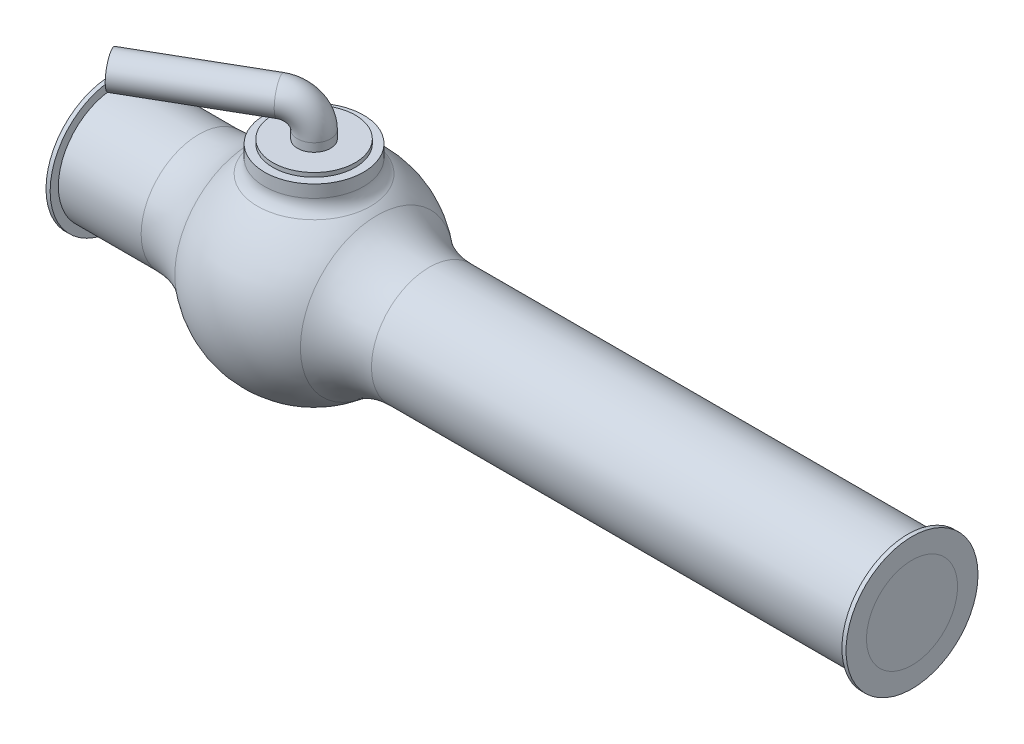
ISO-10303-21;
HEADER;
FILE_DESCRIPTION(('STEP AP214'),'2;1');
FILE_NAME('part.step','',(''),(''),'','','');
FILE_SCHEMA(('AUTOMOTIVE_DESIGN { 1 0 10303 214 1 1 1 1 }'));
ENDSEC;
DATA;
#1=APPLICATION_CONTEXT('core data for automotive mechanical design processes');
#2=APPLICATION_PROTOCOL_DEFINITION('international standard','automotive_design',2000,#1);
#3=PRODUCT_CONTEXT('',#1,'mechanical');
#4=PRODUCT('Part','Part','',(#3));
#5=PRODUCT_RELATED_PRODUCT_CATEGORY('part','',(#4));
#6=PRODUCT_DEFINITION_FORMATION('','',#4);
#7=PRODUCT_DEFINITION_CONTEXT('part definition',#1,'design');
#8=PRODUCT_DEFINITION('design','',#6,#7);
#9=PRODUCT_DEFINITION_SHAPE('','',#8);
#10=(LENGTH_UNIT() NAMED_UNIT(*) SI_UNIT(.MILLI.,.METRE.));
#11=(NAMED_UNIT(*) PLANE_ANGLE_UNIT() SI_UNIT($,.RADIAN.));
#12=(NAMED_UNIT(*) SI_UNIT($,.STERADIAN.) SOLID_ANGLE_UNIT());
#13=UNCERTAINTY_MEASURE_WITH_UNIT(LENGTH_MEASURE(1.E-05),#10,'distance_accuracy_value','');
#14=(GEOMETRIC_REPRESENTATION_CONTEXT(3) GLOBAL_UNCERTAINTY_ASSIGNED_CONTEXT((#13)) GLOBAL_UNIT_ASSIGNED_CONTEXT((#10,
#11,#12)) REPRESENTATION_CONTEXT('',''));
#15=CARTESIAN_POINT('',(0.,0.,0.));
#16=DIRECTION('',(0.,0.,1.));
#17=DIRECTION('',(1.,0.,0.));
#18=AXIS2_PLACEMENT_3D('',#15,#16,#17);
#19=CARTESIAN_POINT('',(0.,0.,0.));
#20=DIRECTION('',(0.,1.,0.));
#21=DIRECTION('',(0.,0.,-1.));
#22=AXIS2_PLACEMENT_3D('',#19,#20,#21);
#23=SPHERICAL_SURFACE('',#22,120.);
#24=CARTESIAN_POINT('',(0.,98.4782167977948,0.));
#25=DIRECTION('',(0.,-1.,0.));
#26=DIRECTION('',(0.,0.,-1.));
#27=AXIS2_PLACEMENT_3D('',#24,#25,#26);
#28=CIRCLE('',#27,68.5714285714286);
#29=CARTESIAN_POINT('',(0.,98.4782167977948,-68.5714285714286));
#30=VERTEX_POINT('',#29);
#31=EDGE_CURVE('P0_E11',#30,#30,#28,.T.);
#32=ORIENTED_EDGE('',*,*,#31,.T.);
#33=EDGE_LOOP('',(#32));
#34=FACE_BOUND('',#33,.T.);
#35=CARTESIAN_POINT('',(76.1685820569215,0.,0.));
#36=DIRECTION('',(-1.,0.,0.));
#37=DIRECTION('',(0.,0.,1.));
#38=AXIS2_PLACEMENT_3D('',#35,#36,#37);
#39=CIRCLE('',#38,92.7272727272727);
#40=CARTESIAN_POINT('',(76.1685820569215,0.,92.7272727272727));
#41=VERTEX_POINT('',#40);
#42=EDGE_CURVE('P0_E89',#41,#41,#39,.T.);
#43=ORIENTED_EDGE('',*,*,#42,.T.);
#44=EDGE_LOOP('',(#43));
#45=FACE_BOUND('',#44,.T.);
#46=CARTESIAN_POINT('',(-76.1685820569215,0.,0.));
#47=DIRECTION('',(1.,0.,0.));
#48=DIRECTION('',(0.,0.,-1.));
#49=AXIS2_PLACEMENT_3D('',#46,#47,#48);
#50=CIRCLE('',#49,92.7272727272727);
#51=CARTESIAN_POINT('',(-76.1685820569215,0.,-92.7272727272727));
#52=VERTEX_POINT('',#51);
#53=EDGE_CURVE('P0_E82',#52,#52,#50,.T.);
#54=ORIENTED_EDGE('',*,*,#53,.T.);
#55=EDGE_LOOP('',(#54));
#56=FACE_BOUND('',#55,.T.);
#57=ADVANCED_FACE('P0_F33',(#34,#45,#56),#23,.T.);
#58=CARTESIAN_POINT('',(0.,0.,0.));
#59=DIRECTION('',(0.,1.,0.));
#60=DIRECTION('',(0.,0.,-1.));
#61=AXIS2_PLACEMENT_3D('',#58,#59,#60);
#62=SPHERICAL_SURFACE('',#61,100.);
#63=CARTESIAN_POINT('',(-83.3885822273715,0.,0.));
#64=DIRECTION('',(1.,0.,0.));
#65=DIRECTION('',(0.,0.,-1.));
#66=AXIS2_PLACEMENT_3D('',#63,#64,#65);
#67=CIRCLE('',#66,55.1936985);
#68=CARTESIAN_POINT('',(-83.3885822273715,-50.4687461797641,22.3439032658002));
#69=VERTEX_POINT('',#68);
#70=CARTESIAN_POINT('',(-83.3885822273715,50.4687461797642,22.3439032658002));
#71=VERTEX_POINT('',#70);
#72=EDGE_CURVE('P0_E47',#69,#71,#67,.F.);
#73=ORIENTED_EDGE('',*,*,#72,.T.);
#74=CARTESIAN_POINT('',(-72.2166305944713,0.,41.6942911136856));
#75=DIRECTION('',(0.86602540378444,0.,-0.499999999999998));
#76=DIRECTION('',(-0.499999999999998,0.,-0.86602540378444));
#77=AXIS2_PLACEMENT_3D('',#74,#75,#76);
#78=CIRCLE('',#77,55.1936985);
#79=EDGE_CURVE('P0_E69',#71,#69,#78,.T.);
#80=ORIENTED_EDGE('',*,*,#79,.T.);
#81=EDGE_LOOP('',(#73,#80));
#82=FACE_BOUND('',#81,.T.);
#83=ADVANCED_FACE('P0_F77',(#82),#62,.F.);
#84=CARTESIAN_POINT('',(0.,135.,0.));
#85=DIRECTION('',(0.,1.,0.));
#86=DIRECTION('',(0.,0.,1.));
#87=AXIS2_PLACEMENT_3D('',#84,#85,#86);
#88=PLANE('',#87);
#89=CARTESIAN_POINT('',(0.,135.,0.));
#90=DIRECTION('',(0.,1.,0.));
#91=DIRECTION('',(0.,0.,1.));
#92=AXIS2_PLACEMENT_3D('',#89,#90,#91);
#93=CIRCLE('',#92,50.);
#94=CARTESIAN_POINT('',(0.,135.,50.));
#95=VERTEX_POINT('',#94);
#96=EDGE_CURVE('P0_E196',#95,#95,#93,.T.);
#97=ORIENTED_EDGE('',*,*,#96,.T.);
#98=EDGE_LOOP('',(#97));
#99=FACE_BOUND('',#98,.T.);
#100=CARTESIAN_POINT('',(0.,135.,0.));
#101=DIRECTION('',(0.,1.,0.));
#102=DIRECTION('',(0.,0.,1.));
#103=AXIS2_PLACEMENT_3D('',#100,#101,#102);
#104=CIRCLE('',#103,20.);
#105=CARTESIAN_POINT('',(0.,135.,20.));
#106=VERTEX_POINT('',#105);
#107=EDGE_CURVE('P0_E185',#106,#106,#104,.T.);
#108=ORIENTED_EDGE('',*,*,#107,.F.);
#109=EDGE_LOOP('',(#108));
#110=FACE_BOUND('',#109,.T.);
#111=ADVANCED_FACE('P0_F115',(#99,#110),#88,.T.);
#112=CARTESIAN_POINT('',(0.,135.,0.));
#113=DIRECTION('',(0.,-1.,0.));
#114=DIRECTION('',(0.,0.,-1.));
#115=AXIS2_PLACEMENT_3D('',#112,#113,#114);
#116=CYLINDRICAL_SURFACE('',#115,50.);
#117=ORIENTED_EDGE('',*,*,#96,.F.);
#118=EDGE_LOOP('',(#117));
#119=FACE_BOUND('',#118,.T.);
#120=CARTESIAN_POINT('',(0.,130.,0.));
#121=DIRECTION('',(0.,1.,0.));
#122=DIRECTION('',(0.,0.,1.));
#123=AXIS2_PLACEMENT_3D('',#120,#121,#122);
#124=CIRCLE('',#123,50.);
#125=CARTESIAN_POINT('',(0.,130.,50.));
#126=VERTEX_POINT('',#125);
#127=EDGE_CURVE('P0_E182',#126,#126,#124,.T.);
#128=ORIENTED_EDGE('',*,*,#127,.T.);
#129=EDGE_LOOP('',(#128));
#130=FACE_BOUND('',#129,.T.);
#131=ADVANCED_FACE('P0_F143',(#119,#130),#116,.T.);
#132=CARTESIAN_POINT('',(-25.9807621135333,175.,14.9999999999999));
#133=DIRECTION('',(-0.866025403784442,0.,0.499999999999995));
#134=DIRECTION('',(0.499999999999995,0.,0.866025403784442));
#135=AXIS2_PLACEMENT_3D('',#132,#133,#134);
#136=CYLINDRICAL_SURFACE('',#135,20.);
#137=CARTESIAN_POINT('',(-25.9807621135333,175.,14.9999999999999));
#138=DIRECTION('',(-0.866025403784442,0.,0.499999999999995));
#139=DIRECTION('',(0.433012701892216,-0.499999999999995,0.750000000000005));
#140=AXIS2_PLACEMENT_3D('',#137,#138,#139);
#141=CIRCLE('',#140,20.);
#142=CARTESIAN_POINT('',(-25.9807621135333,195.,14.9999999999999));
#143=VERTEX_POINT('',#142);
#144=EDGE_CURVE('P0_E189',#143,#143,#141,.T.);
#145=ORIENTED_EDGE('',*,*,#144,.T.);
#146=EDGE_LOOP('',(#145));
#147=FACE_BOUND('',#146,.T.);
#148=CARTESIAN_POINT('',(-155.8845726812,175.,89.9999999999991));
#149=DIRECTION('',(-0.866025403784442,0.,0.499999999999995));
#150=DIRECTION('',(0.433012701892216,-0.499999999999995,0.750000000000005));
#151=AXIS2_PLACEMENT_3D('',#148,#149,#150);
#152=CIRCLE('',#151,20.);
#153=CARTESIAN_POINT('',(-147.224318643355,165.,104.999999999999));
#154=VERTEX_POINT('',#153);
#155=EDGE_CURVE('P0_E194',#154,#154,#152,.T.);
#156=ORIENTED_EDGE('',*,*,#155,.F.);
#157=EDGE_LOOP('',(#156));
#158=FACE_BOUND('',#157,.T.);
#159=ADVANCED_FACE('P0_F139',(#147,#158),#136,.T.);
#160=CARTESIAN_POINT('',(-25.9807621135332,145.,14.9999999999998));
#161=DIRECTION('',(0.499999999999995,0.,0.866025403784442));
#162=DIRECTION('',(0.866025403784442,0.,-0.499999999999995));
#163=AXIS2_PLACEMENT_3D('',#160,#161,#162);
#164=TOROIDAL_SURFACE('',#163,30.,20.);
#165=CARTESIAN_POINT('',(0.,145.,0.));
#166=DIRECTION('',(0.,1.,0.));
#167=DIRECTION('',(0.,0.,1.));
#168=AXIS2_PLACEMENT_3D('',#165,#166,#167);
#169=CIRCLE('',#168,20.);
#170=CARTESIAN_POINT('',(17.3205080756888,145.,-9.9999999999999));
#171=VERTEX_POINT('',#170);
#172=EDGE_CURVE('P0_E186',#171,#171,#169,.T.);
#173=CARTESIAN_POINT('',(-25.9807621135332,145.,14.9999999999998));
#174=DIRECTION('',(0.499999999999995,0.,0.866025403784442));
#175=DIRECTION('',(0.866025403784442,0.,-0.499999999999995));
#176=AXIS2_PLACEMENT_3D('',#173,#174,#175);
#177=CIRCLE('',#176,50.);
#178=EDGE_CURVE('',#171,#143,#177,.T.);
#179=ORIENTED_EDGE('',*,*,#172,.T.);
#180=ORIENTED_EDGE('',*,*,#144,.F.);
#181=ORIENTED_EDGE('',*,*,#178,.T.);
#182=ORIENTED_EDGE('',*,*,#178,.F.);
#183=EDGE_LOOP('',(#179,#181,#180,#182));
#184=FACE_BOUND('',#183,.T.);
#185=ADVANCED_FACE('P0_F135',(#184),#164,.T.);
#186=CARTESIAN_POINT('',(0.,145.,0.));
#187=DIRECTION('',(0.,-1.,0.));
#188=DIRECTION('',(0.,0.,-1.));
#189=AXIS2_PLACEMENT_3D('',#186,#187,#188);
#190=CYLINDRICAL_SURFACE('',#189,20.);
#191=ORIENTED_EDGE('',*,*,#172,.F.);
#192=EDGE_LOOP('',(#191));
#193=FACE_BOUND('',#192,.T.);
#194=ORIENTED_EDGE('',*,*,#107,.T.);
#195=EDGE_LOOP('',(#194));
#196=FACE_BOUND('',#195,.T.);
#197=ADVANCED_FACE('P0_F131',(#193,#196),#190,.T.);
#198=CARTESIAN_POINT('',(-155.8845726812,175.,89.9999999999991));
#199=DIRECTION('',(-0.866025403784442,0.,0.499999999999995));
#200=DIRECTION('',(0.433012701892216,-0.499999999999995,0.750000000000005));
#201=AXIS2_PLACEMENT_3D('',#198,#199,#200);
#202=PLANE('',#201);
#203=ORIENTED_EDGE('',*,*,#155,.T.);
#204=EDGE_LOOP('',(#203));
#205=FACE_BOUND('',#204,.T.);
#206=ADVANCED_FACE('P0_F124',(#205),#202,.T.);
#207=CARTESIAN_POINT('',(0.,180.,0.));
#208=DIRECTION('',(0.,1.,0.));
#209=DIRECTION('',(0.,0.,1.));
#210=AXIS2_PLACEMENT_3D('',#207,#208,#209);
#211=CYLINDRICAL_SURFACE('',#210,60.);
#212=CARTESIAN_POINT('',(0.,114.891252930761,0.));
#213=DIRECTION('',(0.,-1.,0.));
#214=DIRECTION('',(0.,0.,-1.));
#215=AXIS2_PLACEMENT_3D('',#212,#213,#214);
#216=CIRCLE('',#215,60.);
#217=CARTESIAN_POINT('',(0.,114.891252930761,-60.));
#218=VERTEX_POINT('',#217);
#219=EDGE_CURVE('P0_E41',#218,#218,#216,.F.);
#220=ORIENTED_EDGE('',*,*,#219,.T.);
#221=EDGE_LOOP('',(#220));
#222=FACE_BOUND('',#221,.T.);
#223=CARTESIAN_POINT('',(0.,130.,0.));
#224=DIRECTION('',(0.,1.,0.));
#225=DIRECTION('',(0.,0.,1.));
#226=AXIS2_PLACEMENT_3D('',#223,#224,#225);
#227=CIRCLE('',#226,60.);
#228=CARTESIAN_POINT('',(0.,130.,60.));
#229=VERTEX_POINT('',#228);
#230=EDGE_CURVE('P0_E179',#229,#229,#227,.T.);
#231=ORIENTED_EDGE('',*,*,#230,.F.);
#232=EDGE_LOOP('',(#231));
#233=FACE_BOUND('',#232,.T.);
#234=ADVANCED_FACE('P0_F97',(#222,#233),#211,.T.);
#235=CARTESIAN_POINT('',(0.,130.,-40.));
#236=DIRECTION('',(0.,1.,0.));
#237=DIRECTION('',(0.,0.,1.));
#238=AXIS2_PLACEMENT_3D('',#235,#236,#237);
#239=PLANE('',#238);
#240=ORIENTED_EDGE('',*,*,#230,.T.);
#241=EDGE_LOOP('',(#240));
#242=FACE_BOUND('',#241,.T.);
#243=ORIENTED_EDGE('',*,*,#127,.F.);
#244=EDGE_LOOP('',(#243));
#245=FACE_BOUND('',#244,.T.);
#246=ADVANCED_FACE('P0_F123',(#242,#245),#239,.T.);
#247=CARTESIAN_POINT('',(-165.885572681199,0.,0.));
#248=DIRECTION('',(1.,0.,0.));
#249=DIRECTION('',(0.,0.,-1.));
#250=AXIS2_PLACEMENT_3D('',#247,#248,#249);
#251=CYLINDRICAL_SURFACE('',#250,70.);
#252=CARTESIAN_POINT('',(139.642400437689,0.,0.));
#253=DIRECTION('',(-1.,0.,0.));
#254=DIRECTION('',(0.,0.,1.));
#255=AXIS2_PLACEMENT_3D('',#252,#253,#254);
#256=CIRCLE('',#255,70.);
#257=CARTESIAN_POINT('',(139.642400437689,0.,70.));
#258=VERTEX_POINT('',#257);
#259=EDGE_CURVE('P0_E80',#258,#258,#256,.F.);
#260=ORIENTED_EDGE('',*,*,#259,.T.);
#261=EDGE_LOOP('',(#260));
#262=FACE_BOUND('',#261,.T.);
#263=CARTESIAN_POINT('',(720.,0.,0.));
#264=DIRECTION('',(1.,0.,0.));
#265=DIRECTION('',(0.,0.,-1.));
#266=AXIS2_PLACEMENT_3D('',#263,#264,#265);
#267=CIRCLE('',#266,70.);
#268=CARTESIAN_POINT('',(720.,0.,-70.));
#269=VERTEX_POINT('',#268);
#270=EDGE_CURVE('P0_E78',#269,#269,#267,.T.);
#271=ORIENTED_EDGE('',*,*,#270,.F.);
#272=EDGE_LOOP('',(#271));
#273=FACE_BOUND('',#272,.T.);
#274=ADVANCED_FACE('P0_F127',(#262,#273),#251,.T.);
#275=CARTESIAN_POINT('',(118.301270189222,0.,-68.3012701892216));
#276=DIRECTION('',(-0.86602540378444,0.,0.499999999999998));
#277=DIRECTION('',(0.499999999999998,0.,0.86602540378444));
#278=AXIS2_PLACEMENT_3D('',#275,#276,#277);
#279=CYLINDRICAL_SURFACE('',#278,55.1936985);
#280=CARTESIAN_POINT('',(72.2166305944714,0.,-41.6942911136856));
#281=DIRECTION('',(-0.86602540378444,0.,0.499999999999998));
#282=DIRECTION('',(0.499999999999998,0.,0.86602540378444));
#283=AXIS2_PLACEMENT_3D('',#280,#281,#282);
#284=CIRCLE('',#283,55.1936985);
#285=CARTESIAN_POINT('',(83.3885822273715,50.4687461797642,-22.3439032658004));
#286=VERTEX_POINT('',#285);
#287=CARTESIAN_POINT('',(83.3885822273715,-50.4687461797642,-22.3439032658004));
#288=VERTEX_POINT('',#287);
#289=EDGE_CURVE('P0_E70',#286,#288,#284,.T.);
#290=ORIENTED_EDGE('',*,*,#289,.F.);
#291=EDGE_CURVE('P0_E198',#288,#286,#284,.T.);
#292=ORIENTED_EDGE('',*,*,#291,.F.);
#293=EDGE_LOOP('',(#290,#292));
#294=FACE_BOUND('',#293,.T.);
#295=ORIENTED_EDGE('',*,*,#79,.F.);
#296=EDGE_CURVE('P0_E63',#69,#71,#78,.T.);
#297=ORIENTED_EDGE('',*,*,#296,.F.);
#298=EDGE_LOOP('',(#295,#297));
#299=FACE_BOUND('',#298,.T.);
#300=ADVANCED_FACE('P0_F79',(#294,#299),#279,.F.);
#301=CARTESIAN_POINT('',(0.,0.,0.));
#302=DIRECTION('',(0.,1.,0.));
#303=DIRECTION('',(0.,0.,-1.));
#304=AXIS2_PLACEMENT_3D('',#301,#302,#303);
#305=SPHERICAL_SURFACE('',#304,100.);
#306=ORIENTED_EDGE('',*,*,#291,.T.);
#307=CARTESIAN_POINT('',(83.3885822273715,0.,0.));
#308=DIRECTION('',(-1.,0.,0.));
#309=DIRECTION('',(0.,0.,1.));
#310=AXIS2_PLACEMENT_3D('',#307,#308,#309);
#311=CIRCLE('',#310,55.1936985);
#312=EDGE_CURVE('P0_E174',#288,#286,#311,.T.);
#313=ORIENTED_EDGE('',*,*,#312,.F.);
#314=EDGE_LOOP('',(#306,#313));
#315=FACE_BOUND('',#314,.T.);
#316=ADVANCED_FACE('P0_F153',(#315),#305,.T.);
#317=ORIENTED_EDGE('',*,*,#289,.T.);
#318=EDGE_CURVE('P0_E54',#286,#288,#311,.T.);
#319=ORIENTED_EDGE('',*,*,#318,.F.);
#320=EDGE_LOOP('',(#317,#319));
#321=FACE_BOUND('',#320,.T.);
#322=ADVANCED_FACE('P0_F117',(#321),#62,.F.);
#323=CARTESIAN_POINT('',(-165.885572681199,0.,0.));
#324=DIRECTION('',(1.,0.,0.));
#325=DIRECTION('',(0.,0.,-1.));
#326=AXIS2_PLACEMENT_3D('',#323,#324,#325);
#327=CYLINDRICAL_SURFACE('',#326,55.1936985);
#328=ORIENTED_EDGE('',*,*,#318,.T.);
#329=ORIENTED_EDGE('',*,*,#312,.T.);
#330=EDGE_LOOP('',(#328,#329));
#331=FACE_BOUND('',#330,.T.);
#332=CARTESIAN_POINT('',(725.,0.,0.));
#333=DIRECTION('',(1.,0.,0.));
#334=DIRECTION('',(0.,0.,-1.));
#335=AXIS2_PLACEMENT_3D('',#332,#333,#334);
#336=CIRCLE('',#335,55.1936985);
#337=CARTESIAN_POINT('',(725.,0.,-55.1936985));
#338=VERTEX_POINT('',#337);
#339=EDGE_CURVE('P0_E258',#338,#338,#336,.T.);
#340=ORIENTED_EDGE('',*,*,#339,.T.);
#341=EDGE_LOOP('',(#340));
#342=FACE_BOUND('',#341,.T.);
#343=ADVANCED_FACE('P0_F206',(#331,#342),#327,.F.);
#344=CARTESIAN_POINT('',(0.,0.,0.));
#345=DIRECTION('',(0.,1.,0.));
#346=DIRECTION('',(0.,0.,-1.));
#347=AXIS2_PLACEMENT_3D('',#344,#345,#346);
#348=SPHERICAL_SURFACE('',#347,100.);
#349=ORIENTED_EDGE('',*,*,#296,.T.);
#350=EDGE_CURVE('P0_E65',#71,#69,#67,.F.);
#351=ORIENTED_EDGE('',*,*,#350,.T.);
#352=EDGE_LOOP('',(#349,#351));
#353=FACE_BOUND('',#352,.T.);
#354=ADVANCED_FACE('P0_F64',(#353),#348,.T.);
#355=CARTESIAN_POINT('',(720.001,0.,0.));
#356=DIRECTION('',(-1.,0.,0.));
#357=DIRECTION('',(0.,0.,1.));
#358=AXIS2_PLACEMENT_3D('',#355,#356,#357);
#359=CYLINDRICAL_SURFACE('',#358,55.1936985);
#360=ORIENTED_EDGE('',*,*,#72,.F.);
#361=ORIENTED_EDGE('',*,*,#350,.F.);
#362=EDGE_LOOP('',(#360,#361));
#363=FACE_BOUND('',#362,.T.);
#364=CARTESIAN_POINT('',(-245.,0.,0.));
#365=DIRECTION('',(-1.,0.,0.));
#366=DIRECTION('',(0.,0.,1.));
#367=AXIS2_PLACEMENT_3D('',#364,#365,#366);
#368=CIRCLE('',#367,55.1936985);
#369=CARTESIAN_POINT('',(-245.,0.,55.1936985));
#370=VERTEX_POINT('',#369);
#371=EDGE_CURVE('P0_E248',#370,#370,#368,.T.);
#372=ORIENTED_EDGE('',*,*,#371,.T.);
#373=EDGE_LOOP('',(#372));
#374=FACE_BOUND('',#373,.T.);
#375=ADVANCED_FACE('P0_F72',(#363,#374),#359,.F.);
#376=CARTESIAN_POINT('',(720.001,0.,0.));
#377=DIRECTION('',(-1.,0.,0.));
#378=DIRECTION('',(0.,0.,1.));
#379=AXIS2_PLACEMENT_3D('',#376,#377,#378);
#380=CYLINDRICAL_SURFACE('',#379,70.);
#381=CARTESIAN_POINT('',(-139.642400437689,0.,0.));
#382=DIRECTION('',(1.,0.,0.));
#383=DIRECTION('',(0.,0.,-1.));
#384=AXIS2_PLACEMENT_3D('',#381,#382,#383);
#385=CIRCLE('',#384,70.);
#386=CARTESIAN_POINT('',(-139.642400437689,0.,-70.));
#387=VERTEX_POINT('',#386);
#388=EDGE_CURVE('P0_E92',#387,#387,#385,.F.);
#389=ORIENTED_EDGE('',*,*,#388,.T.);
#390=EDGE_LOOP('',(#389));
#391=FACE_BOUND('',#390,.T.);
#392=CARTESIAN_POINT('',(-240.,0.,0.));
#393=DIRECTION('',(-1.,0.,0.));
#394=DIRECTION('',(0.,0.,1.));
#395=AXIS2_PLACEMENT_3D('',#392,#393,#394);
#396=CIRCLE('',#395,70.);
#397=CARTESIAN_POINT('',(-240.,0.,70.));
#398=VERTEX_POINT('',#397);
#399=EDGE_CURVE('P0_E254',#398,#398,#396,.T.);
#400=ORIENTED_EDGE('',*,*,#399,.F.);
#401=EDGE_LOOP('',(#400));
#402=FACE_BOUND('',#401,.T.);
#403=ADVANCED_FACE('P0_F219',(#391,#402),#380,.T.);
#404=CARTESIAN_POINT('',(725.,0.,0.));
#405=DIRECTION('',(1.,0.,0.));
#406=DIRECTION('',(0.,0.,-1.));
#407=AXIS2_PLACEMENT_3D('',#404,#405,#406);
#408=PLANE('',#407);
#409=CARTESIAN_POINT('',(725.,0.,0.));
#410=DIRECTION('',(1.,0.,0.));
#411=DIRECTION('',(0.,0.,-1.));
#412=AXIS2_PLACEMENT_3D('',#409,#410,#411);
#413=CIRCLE('',#412,80.);
#414=CARTESIAN_POINT('',(725.,0.,-80.));
#415=VERTEX_POINT('',#414);
#416=EDGE_CURVE('P0_E74',#415,#415,#413,.T.);
#417=ORIENTED_EDGE('',*,*,#416,.T.);
#418=EDGE_LOOP('',(#417));
#419=FACE_BOUND('',#418,.T.);
#420=ORIENTED_EDGE('',*,*,#339,.F.);
#421=EDGE_LOOP('',(#420));
#422=FACE_BOUND('',#421,.T.);
#423=ADVANCED_FACE('P0_F222',(#419,#422),#408,.T.);
#424=CARTESIAN_POINT('',(720.,0.,0.));
#425=DIRECTION('',(1.,0.,0.));
#426=DIRECTION('',(0.,0.,-1.));
#427=AXIS2_PLACEMENT_3D('',#424,#425,#426);
#428=PLANE('',#427);
#429=ORIENTED_EDGE('',*,*,#270,.T.);
#430=EDGE_LOOP('',(#429));
#431=FACE_BOUND('',#430,.T.);
#432=CARTESIAN_POINT('',(720.,0.,0.));
#433=DIRECTION('',(1.,0.,0.));
#434=DIRECTION('',(0.,0.,-1.));
#435=AXIS2_PLACEMENT_3D('',#432,#433,#434);
#436=CIRCLE('',#435,80.);
#437=CARTESIAN_POINT('',(720.,0.,-80.));
#438=VERTEX_POINT('',#437);
#439=EDGE_CURVE('P0_E261',#438,#438,#436,.T.);
#440=ORIENTED_EDGE('',*,*,#439,.F.);
#441=EDGE_LOOP('',(#440));
#442=FACE_BOUND('',#441,.T.);
#443=ADVANCED_FACE('P0_F228',(#431,#442),#428,.F.);
#444=CARTESIAN_POINT('',(725.,0.,0.));
#445=DIRECTION('',(-1.,0.,0.));
#446=DIRECTION('',(0.,0.,1.));
#447=AXIS2_PLACEMENT_3D('',#444,#445,#446);
#448=CYLINDRICAL_SURFACE('',#447,80.);
#449=ORIENTED_EDGE('',*,*,#416,.F.);
#450=EDGE_LOOP('',(#449));
#451=FACE_BOUND('',#450,.T.);
#452=ORIENTED_EDGE('',*,*,#439,.T.);
#453=EDGE_LOOP('',(#452));
#454=FACE_BOUND('',#453,.T.);
#455=ADVANCED_FACE('P0_F224',(#451,#454),#448,.T.);
#456=CARTESIAN_POINT('',(-240.,0.,0.));
#457=DIRECTION('',(-1.,0.,0.));
#458=DIRECTION('',(0.,0.,1.));
#459=AXIS2_PLACEMENT_3D('',#456,#457,#458);
#460=PLANE('',#459);
#461=CARTESIAN_POINT('',(-240.,0.,0.));
#462=DIRECTION('',(-1.,0.,0.));
#463=DIRECTION('',(0.,0.,1.));
#464=AXIS2_PLACEMENT_3D('',#461,#462,#463);
#465=CIRCLE('',#464,80.);
#466=CARTESIAN_POINT('',(-240.,0.,80.));
#467=VERTEX_POINT('',#466);
#468=EDGE_CURVE('P0_E249',#467,#467,#465,.T.);
#469=ORIENTED_EDGE('',*,*,#468,.F.);
#470=EDGE_LOOP('',(#469));
#471=FACE_BOUND('',#470,.T.);
#472=ORIENTED_EDGE('',*,*,#399,.T.);
#473=EDGE_LOOP('',(#472));
#474=FACE_BOUND('',#473,.T.);
#475=ADVANCED_FACE('P0_F227',(#471,#474),#460,.F.);
#476=CARTESIAN_POINT('',(-245.,0.,0.));
#477=DIRECTION('',(-1.,0.,0.));
#478=DIRECTION('',(0.,0.,1.));
#479=AXIS2_PLACEMENT_3D('',#476,#477,#478);
#480=PLANE('',#479);
#481=CARTESIAN_POINT('',(-245.,0.,0.));
#482=DIRECTION('',(-1.,0.,0.));
#483=DIRECTION('',(0.,0.,1.));
#484=AXIS2_PLACEMENT_3D('',#481,#482,#483);
#485=CIRCLE('',#484,80.);
#486=CARTESIAN_POINT('',(-245.,0.,80.));
#487=VERTEX_POINT('',#486);
#488=EDGE_CURVE('P0_E245',#487,#487,#485,.T.);
#489=ORIENTED_EDGE('',*,*,#488,.T.);
#490=EDGE_LOOP('',(#489));
#491=FACE_BOUND('',#490,.T.);
#492=ORIENTED_EDGE('',*,*,#371,.F.);
#493=EDGE_LOOP('',(#492));
#494=FACE_BOUND('',#493,.T.);
#495=ADVANCED_FACE('P0_F161',(#491,#494),#480,.T.);
#496=CARTESIAN_POINT('',(-245.,0.,0.));
#497=DIRECTION('',(1.,0.,0.));
#498=DIRECTION('',(0.,0.,-1.));
#499=AXIS2_PLACEMENT_3D('',#496,#497,#498);
#500=CYLINDRICAL_SURFACE('',#499,80.);
#501=ORIENTED_EDGE('',*,*,#488,.F.);
#502=EDGE_LOOP('',(#501));
#503=FACE_BOUND('',#502,.T.);
#504=ORIENTED_EDGE('',*,*,#468,.T.);
#505=EDGE_LOOP('',(#504));
#506=FACE_BOUND('',#505,.T.);
#507=ADVANCED_FACE('P0_F156',(#503,#506),#500,.T.);
#508=CARTESIAN_POINT('',(139.642400437689,0.,0.));
#509=DIRECTION('',(-1.,0.,0.));
#510=DIRECTION('',(0.,0.,1.));
#511=AXIS2_PLACEMENT_3D('',#508,#509,#510);
#512=TOROIDAL_SURFACE('',#511,170.,100.);
#513=ORIENTED_EDGE('',*,*,#42,.F.);
#514=EDGE_LOOP('',(#513));
#515=FACE_BOUND('',#514,.T.);
#516=ORIENTED_EDGE('',*,*,#259,.F.);
#517=EDGE_LOOP('',(#516));
#518=FACE_BOUND('',#517,.T.);
#519=ADVANCED_FACE('P0_F106',(#515,#518),#512,.F.);
#520=CARTESIAN_POINT('',(-139.642400437689,0.,0.));
#521=DIRECTION('',(1.,0.,0.));
#522=DIRECTION('',(0.,0.,-1.));
#523=AXIS2_PLACEMENT_3D('',#520,#521,#522);
#524=TOROIDAL_SURFACE('',#523,170.,100.);
#525=ORIENTED_EDGE('',*,*,#53,.F.);
#526=EDGE_LOOP('',(#525));
#527=FACE_BOUND('',#526,.T.);
#528=ORIENTED_EDGE('',*,*,#388,.F.);
#529=EDGE_LOOP('',(#528));
#530=FACE_BOUND('',#529,.T.);
#531=ADVANCED_FACE('P0_F101',(#527,#530),#524,.F.);
#532=CARTESIAN_POINT('',(0.,114.891252930761,0.));
#533=DIRECTION('',(0.,-1.,0.));
#534=DIRECTION('',(0.,0.,-1.));
#535=AXIS2_PLACEMENT_3D('',#532,#533,#534);
#536=TOROIDAL_SURFACE('',#535,80.,20.);
#537=ORIENTED_EDGE('',*,*,#31,.F.);
#538=EDGE_LOOP('',(#537));
#539=FACE_BOUND('',#538,.T.);
#540=ORIENTED_EDGE('',*,*,#219,.F.);
#541=EDGE_LOOP('',(#540));
#542=FACE_BOUND('',#541,.T.);
#543=ADVANCED_FACE('P0_F35',(#539,#542),#536,.F.);
#544=CLOSED_SHELL('',(#57,#83,#111,#131,#159,#185,#197,#206,#234,#246,#274,#300,#316,#322,#343,
#354,#375,#403,#423,#443,#455,#475,#495,#507,#519,#531,#543));
#545=MANIFOLD_SOLID_BREP('P0_B2',#544);
#546=CARTESIAN_POINT('',(-239.748482659427,0.,0.));
#547=DIRECTION('',(-1.,0.,0.));
#548=DIRECTION('',(0.,0.,1.));
#549=AXIS2_PLACEMENT_3D('',#546,#547,#548);
#550=CYLINDRICAL_SURFACE('',#549,55.1936985);
#551=CARTESIAN_POINT('',(-239.748482659427,0.,0.));
#552=DIRECTION('',(-1.,0.,0.));
#553=DIRECTION('',(0.,0.,1.));
#554=AXIS2_PLACEMENT_3D('',#551,#552,#553);
#555=CIRCLE('',#554,55.1936985);
#556=CARTESIAN_POINT('',(-239.748482659427,0.,55.1936985));
#557=VERTEX_POINT('',#556);
#558=EDGE_CURVE('P1_E10',#557,#557,#555,.T.);
#559=ORIENTED_EDGE('',*,*,#558,.T.);
#560=EDGE_LOOP('',(#559));
#561=FACE_BOUND('',#560,.T.);
#562=CARTESIAN_POINT('',(-245.,0.,0.));
#563=DIRECTION('',(-1.,0.,0.));
#564=DIRECTION('',(0.,0.,1.));
#565=AXIS2_PLACEMENT_3D('',#562,#563,#564);
#566=CIRCLE('',#565,55.1936985);
#567=CARTESIAN_POINT('',(-245.,0.,55.1936985));
#568=VERTEX_POINT('',#567);
#569=EDGE_CURVE('P1_E17',#568,#568,#566,.T.);
#570=ORIENTED_EDGE('',*,*,#569,.F.);
#571=EDGE_LOOP('',(#570));
#572=FACE_BOUND('',#571,.T.);
#573=ADVANCED_FACE('P1_F14',(#561,#572),#550,.T.);
#574=CARTESIAN_POINT('',(-239.748482659427,0.,-55.1936985));
#575=DIRECTION('',(-1.,0.,0.));
#576=DIRECTION('',(0.,-1.,0.));
#577=AXIS2_PLACEMENT_3D('',#574,#575,#576);
#578=PLANE('',#577);
#579=ORIENTED_EDGE('',*,*,#558,.F.);
#580=EDGE_LOOP('',(#579));
#581=FACE_BOUND('',#580,.T.);
#582=ADVANCED_FACE('P1_F29',(#581),#578,.F.);
#583=CARTESIAN_POINT('',(-245.,0.,-55.1936985));
#584=DIRECTION('',(-1.,0.,0.));
#585=DIRECTION('',(0.,-1.,0.));
#586=AXIS2_PLACEMENT_3D('',#583,#584,#585);
#587=PLANE('',#586);
#588=ORIENTED_EDGE('',*,*,#569,.T.);
#589=EDGE_LOOP('',(#588));
#590=FACE_BOUND('',#589,.T.);
#591=ADVANCED_FACE('P1_F26',(#590),#587,.T.);
#592=CLOSED_SHELL('',(#573,#582,#591));
#593=MANIFOLD_SOLID_BREP('P1_B1',#592);
#594=CARTESIAN_POINT('',(719.748482659427,0.,0.));
#595=DIRECTION('',(1.,0.,0.));
#596=DIRECTION('',(0.,0.,-1.));
#597=AXIS2_PLACEMENT_3D('',#594,#595,#596);
#598=CYLINDRICAL_SURFACE('',#597,55.1936985);
#599=CARTESIAN_POINT('',(719.748482659427,0.,0.));
#600=DIRECTION('',(1.,0.,0.));
#601=DIRECTION('',(0.,0.,-1.));
#602=AXIS2_PLACEMENT_3D('',#599,#600,#601);
#603=CIRCLE('',#602,55.1936985);
#604=CARTESIAN_POINT('',(719.748482659427,0.,-55.1936985));
#605=VERTEX_POINT('',#604);
#606=EDGE_CURVE('P2_E10',#605,#605,#603,.T.);
#607=ORIENTED_EDGE('',*,*,#606,.T.);
#608=EDGE_LOOP('',(#607));
#609=FACE_BOUND('',#608,.T.);
#610=CARTESIAN_POINT('',(725.,0.,0.));
#611=DIRECTION('',(1.,0.,0.));
#612=DIRECTION('',(0.,0.,-1.));
#613=AXIS2_PLACEMENT_3D('',#610,#611,#612);
#614=CIRCLE('',#613,55.1936985);
#615=CARTESIAN_POINT('',(725.,0.,-55.1936985));
#616=VERTEX_POINT('',#615);
#617=EDGE_CURVE('P2_E17',#616,#616,#614,.T.);
#618=ORIENTED_EDGE('',*,*,#617,.F.);
#619=EDGE_LOOP('',(#618));
#620=FACE_BOUND('',#619,.T.);
#621=ADVANCED_FACE('P2_F14',(#609,#620),#598,.T.);
#622=CARTESIAN_POINT('',(719.748482659427,0.,55.1936985));
#623=DIRECTION('',(1.,0.,0.));
#624=DIRECTION('',(0.,1.,0.));
#625=AXIS2_PLACEMENT_3D('',#622,#623,#624);
#626=PLANE('',#625);
#627=ORIENTED_EDGE('',*,*,#606,.F.);
#628=EDGE_LOOP('',(#627));
#629=FACE_BOUND('',#628,.T.);
#630=ADVANCED_FACE('P2_F29',(#629),#626,.F.);
#631=CARTESIAN_POINT('',(725.,0.,55.1936985));
#632=DIRECTION('',(1.,0.,0.));
#633=DIRECTION('',(0.,1.,0.));
#634=AXIS2_PLACEMENT_3D('',#631,#632,#633);
#635=PLANE('',#634);
#636=ORIENTED_EDGE('',*,*,#617,.T.);
#637=EDGE_LOOP('',(#636));
#638=FACE_BOUND('',#637,.T.);
#639=ADVANCED_FACE('P2_F26',(#638),#635,.T.);
#640=CLOSED_SHELL('',(#621,#630,#639));
#641=MANIFOLD_SOLID_BREP('P2_B1',#640);
#642=ADVANCED_BREP_SHAPE_REPRESENTATION('',(#18,#545,#593,#641),#14);
#643=SHAPE_DEFINITION_REPRESENTATION(#9,#642);
ENDSEC;
END-ISO-10303-21;
